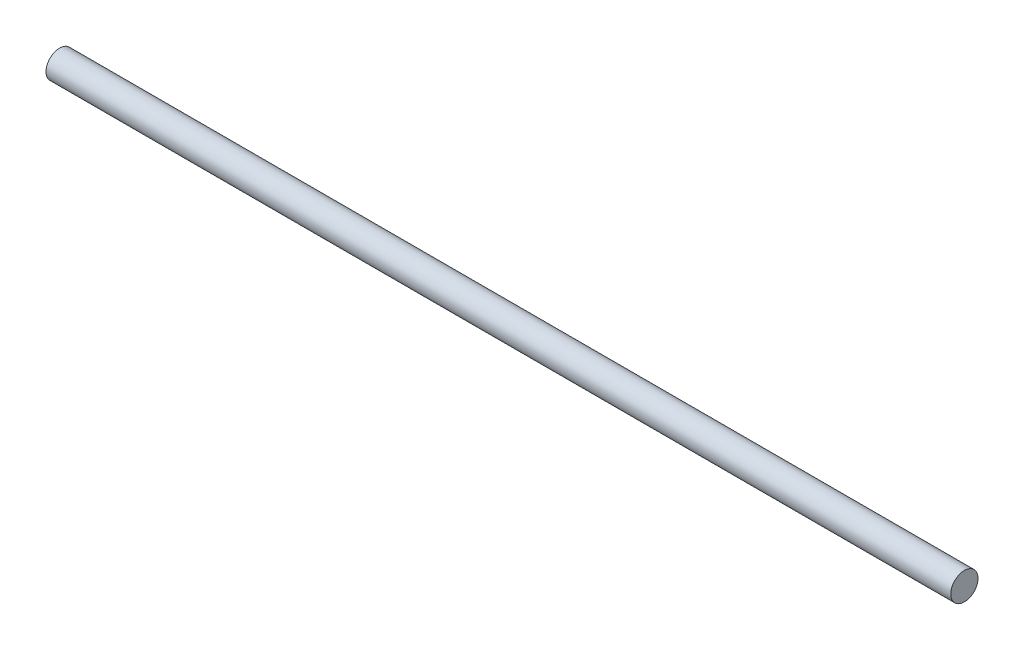
ISO-10303-21;
HEADER;
FILE_DESCRIPTION(('STEP AP214'),'2;1');
FILE_NAME('part.step','',(''),(''),'','','');
FILE_SCHEMA(('AUTOMOTIVE_DESIGN { 1 0 10303 214 1 1 1 1 }'));
ENDSEC;
DATA;
#1=APPLICATION_CONTEXT('core data for automotive mechanical design processes');
#2=APPLICATION_PROTOCOL_DEFINITION('international standard','automotive_design',2000,#1);
#3=PRODUCT_CONTEXT('',#1,'mechanical');
#4=PRODUCT('Part','Part','',(#3));
#5=PRODUCT_RELATED_PRODUCT_CATEGORY('part','',(#4));
#6=PRODUCT_DEFINITION_FORMATION('','',#4);
#7=PRODUCT_DEFINITION_CONTEXT('part definition',#1,'design');
#8=PRODUCT_DEFINITION('design','',#6,#7);
#9=PRODUCT_DEFINITION_SHAPE('','',#8);
#10=(LENGTH_UNIT() NAMED_UNIT(*) SI_UNIT(.MILLI.,.METRE.));
#11=(NAMED_UNIT(*) PLANE_ANGLE_UNIT() SI_UNIT($,.RADIAN.));
#12=(NAMED_UNIT(*) SI_UNIT($,.STERADIAN.) SOLID_ANGLE_UNIT());
#13=UNCERTAINTY_MEASURE_WITH_UNIT(LENGTH_MEASURE(1.E-05),#10,'distance_accuracy_value','');
#14=(GEOMETRIC_REPRESENTATION_CONTEXT(3) GLOBAL_UNCERTAINTY_ASSIGNED_CONTEXT((#13)) GLOBAL_UNIT_ASSIGNED_CONTEXT((#10,
#11,#12)) REPRESENTATION_CONTEXT('',''));
#15=CARTESIAN_POINT('',(0.,0.,0.));
#16=DIRECTION('',(0.,0.,1.));
#17=DIRECTION('',(1.,0.,0.));
#18=AXIS2_PLACEMENT_3D('',#15,#16,#17);
#19=CARTESIAN_POINT('',(497.5,0.,0.));
#20=DIRECTION('',(-1.,0.,0.));
#21=DIRECTION('',(0.,0.,1.));
#22=AXIS2_PLACEMENT_3D('',#19,#20,#21);
#23=CYLINDRICAL_SURFACE('',#22,7.5);
#24=CARTESIAN_POINT('',(497.5,0.,0.));
#25=DIRECTION('',(1.,0.,0.));
#26=DIRECTION('',(0.,0.,-1.));
#27=AXIS2_PLACEMENT_3D('',#24,#25,#26);
#28=CIRCLE('',#27,7.5);
#29=CARTESIAN_POINT('',(497.5,0.,7.5));
#30=VERTEX_POINT('',#29);
#31=EDGE_CURVE('E10',#30,#30,#28,.T.);
#32=CARTESIAN_POINT('',(0.,0.,0.));
#33=DIRECTION('',(1.,0.,0.));
#34=DIRECTION('',(0.,0.,-1.));
#35=AXIS2_PLACEMENT_3D('',#32,#33,#34);
#36=CIRCLE('',#35,7.5);
#37=CARTESIAN_POINT('',(0.,0.,7.5));
#38=VERTEX_POINT('',#37);
#39=EDGE_CURVE('E40',#38,#38,#36,.T.);
#40=CARTESIAN_POINT('',(497.5,0.,7.5));
#41=CARTESIAN_POINT('',(492.317708333333,0.,7.5));
#42=CARTESIAN_POINT('',(487.135416666667,0.,7.5));
#43=CARTESIAN_POINT('',(476.770833333333,0.,7.5));
#44=CARTESIAN_POINT('',(471.588541666667,0.,7.5));
#45=CARTESIAN_POINT('',(461.223958333333,0.,7.5));
#46=CARTESIAN_POINT('',(456.041666666667,0.,7.5));
#47=CARTESIAN_POINT('',(445.677083333333,0.,7.5));
#48=CARTESIAN_POINT('',(440.494791666667,0.,7.5));
#49=CARTESIAN_POINT('',(430.130208333333,0.,7.5));
#50=CARTESIAN_POINT('',(424.947916666667,0.,7.5));
#51=CARTESIAN_POINT('',(414.583333333333,0.,7.5));
#52=CARTESIAN_POINT('',(409.401041666667,0.,7.5));
#53=CARTESIAN_POINT('',(399.036458333333,0.,7.5));
#54=CARTESIAN_POINT('',(393.854166666667,0.,7.5));
#55=CARTESIAN_POINT('',(383.489583333333,0.,7.5));
#56=CARTESIAN_POINT('',(378.307291666667,0.,7.5));
#57=CARTESIAN_POINT('',(367.942708333333,0.,7.5));
#58=CARTESIAN_POINT('',(362.760416666667,0.,7.5));
#59=CARTESIAN_POINT('',(352.395833333333,0.,7.5));
#60=CARTESIAN_POINT('',(347.213541666667,0.,7.5));
#61=CARTESIAN_POINT('',(336.848958333333,0.,7.5));
#62=CARTESIAN_POINT('',(331.666666666667,0.,7.5));
#63=CARTESIAN_POINT('',(321.302083333333,0.,7.5));
#64=CARTESIAN_POINT('',(316.119791666667,0.,7.5));
#65=CARTESIAN_POINT('',(305.755208333333,0.,7.5));
#66=CARTESIAN_POINT('',(300.572916666667,0.,7.5));
#67=CARTESIAN_POINT('',(290.208333333333,0.,7.5));
#68=CARTESIAN_POINT('',(285.026041666667,0.,7.5));
#69=CARTESIAN_POINT('',(274.661458333333,0.,7.5));
#70=CARTESIAN_POINT('',(269.479166666667,0.,7.5));
#71=CARTESIAN_POINT('',(259.114583333333,0.,7.5));
#72=CARTESIAN_POINT('',(253.932291666667,0.,7.5));
#73=CARTESIAN_POINT('',(243.567708333333,0.,7.5));
#74=CARTESIAN_POINT('',(238.385416666667,0.,7.5));
#75=CARTESIAN_POINT('',(228.020833333333,0.,7.5));
#76=CARTESIAN_POINT('',(222.838541666667,0.,7.5));
#77=CARTESIAN_POINT('',(212.473958333333,0.,7.5));
#78=CARTESIAN_POINT('',(207.291666666667,0.,7.5));
#79=CARTESIAN_POINT('',(196.927083333333,0.,7.5));
#80=CARTESIAN_POINT('',(191.744791666667,0.,7.5));
#81=CARTESIAN_POINT('',(181.380208333333,0.,7.5));
#82=CARTESIAN_POINT('',(176.197916666667,0.,7.5));
#83=CARTESIAN_POINT('',(165.833333333333,0.,7.5));
#84=CARTESIAN_POINT('',(160.651041666667,0.,7.5));
#85=CARTESIAN_POINT('',(150.286458333333,0.,7.5));
#86=CARTESIAN_POINT('',(145.104166666667,0.,7.5));
#87=CARTESIAN_POINT('',(134.739583333333,0.,7.5));
#88=CARTESIAN_POINT('',(129.557291666667,0.,7.5));
#89=CARTESIAN_POINT('',(119.192708333333,0.,7.5));
#90=CARTESIAN_POINT('',(114.010416666667,0.,7.5));
#91=CARTESIAN_POINT('',(103.645833333333,0.,7.5));
#92=CARTESIAN_POINT('',(98.4635416666667,0.,7.5));
#93=CARTESIAN_POINT('',(88.0989583333333,0.,7.5));
#94=CARTESIAN_POINT('',(82.9166666666667,0.,7.5));
#95=CARTESIAN_POINT('',(72.5520833333334,0.,7.5));
#96=CARTESIAN_POINT('',(67.3697916666667,0.,7.5));
#97=CARTESIAN_POINT('',(57.0052083333333,0.,7.5));
#98=CARTESIAN_POINT('',(51.8229166666667,0.,7.5));
#99=CARTESIAN_POINT('',(41.4583333333333,0.,7.5));
#100=CARTESIAN_POINT('',(36.2760416666667,0.,7.5));
#101=CARTESIAN_POINT('',(25.9114583333334,0.,7.5));
#102=CARTESIAN_POINT('',(20.7291666666667,0.,7.5));
#103=CARTESIAN_POINT('',(10.3645833333333,0.,7.5));
#104=CARTESIAN_POINT('',(5.18229166666668,0.,7.5));
#105=CARTESIAN_POINT('',(0.,0.,7.5));
#106=B_SPLINE_CURVE_WITH_KNOTS('',3,(#40,#41,#42,#43,#44,#45,#46,#47,#48,#49,#50,#51,#52,#53,
#54,#55,#56,#57,#58,#59,#60,#61,#62,#63,#64,#65,#66,#67,#68,#69,#70,#71,#72,#73,#74,#75,#76,#77,
#78,#79,#80,#81,#82,#83,#84,#85,#86,#87,#88,#89,#90,#91,#92,#93,#94,#95,#96,#97,#98,#99,#100,
#101,#102,#103,#104,#105),.UNSPECIFIED.,.F.,.F.,(4,2,2,2,2,2,2,2,2,2,2,2,2,2,2,2,2,2,2,2,2,2,2,
2,2,2,2,2,2,2,2,2,4),(0.,15.546875,31.09375,46.640625,62.1875,77.734375,93.28125,108.828125,
124.375,139.921875,155.46875,171.015625,186.5625,202.109375,217.65625,233.203125,248.75,
264.296875,279.84375,295.390625,310.9375,326.484375,342.03125,357.578125,373.125,388.671875,
404.21875,419.765625,435.3125,450.859375,466.40625,481.953125,497.5),.UNSPECIFIED.);
#107=EDGE_CURVE('BSEAM37',#30,#38,#106,.T.);
#108=ORIENTED_EDGE('',*,*,#31,.F.);
#109=ORIENTED_EDGE('',*,*,#39,.T.);
#110=ORIENTED_EDGE('',*,*,#107,.T.);
#111=ORIENTED_EDGE('',*,*,#107,.F.);
#112=EDGE_LOOP('',(#108,#110,#109,#111));
#113=FACE_BOUND('',#112,.T.);
#114=ADVANCED_FACE('F37',(#113),#23,.T.);
#115=CARTESIAN_POINT('',(497.5,0.,0.));
#116=DIRECTION('',(1.,0.,0.));
#117=DIRECTION('',(0.,0.,-1.));
#118=AXIS2_PLACEMENT_3D('',#115,#116,#117);
#119=PLANE('',#118);
#120=ORIENTED_EDGE('',*,*,#31,.T.);
#121=EDGE_LOOP('',(#120));
#122=FACE_BOUND('',#121,.T.);
#123=ADVANCED_FACE('F54',(#122),#119,.T.);
#124=CARTESIAN_POINT('',(0.,0.,0.));
#125=DIRECTION('',(1.,0.,0.));
#126=DIRECTION('',(0.,0.,-1.));
#127=AXIS2_PLACEMENT_3D('',#124,#125,#126);
#128=PLANE('',#127);
#129=ORIENTED_EDGE('',*,*,#39,.F.);
#130=EDGE_LOOP('',(#129));
#131=FACE_BOUND('',#130,.T.);
#132=ADVANCED_FACE('F52',(#131),#128,.F.);
#133=CLOSED_SHELL('',(#114,#123,#132));
#134=MANIFOLD_SOLID_BREP('B2',#133);
#135=ADVANCED_BREP_SHAPE_REPRESENTATION('',(#18,#134),#14);
#136=SHAPE_DEFINITION_REPRESENTATION(#9,#135);
ENDSEC;
END-ISO-10303-21;
